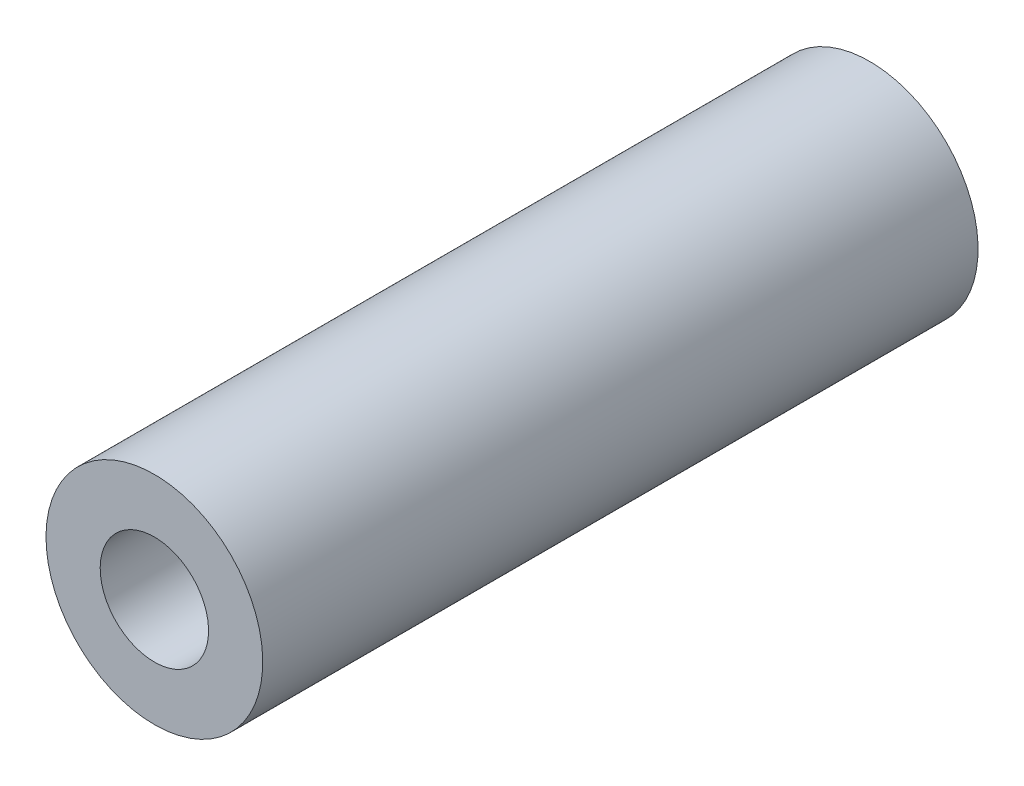
ISO-10303-21;
HEADER;
FILE_DESCRIPTION(('STEP AP214'),'2;1');
FILE_NAME('part.step','',(''),(''),'','','');
FILE_SCHEMA(('AUTOMOTIVE_DESIGN { 1 0 10303 214 1 1 1 1 }'));
ENDSEC;
DATA;
#1=APPLICATION_CONTEXT('core data for automotive mechanical design processes');
#2=APPLICATION_PROTOCOL_DEFINITION('international standard','automotive_design',2000,#1);
#3=PRODUCT_CONTEXT('',#1,'mechanical');
#4=PRODUCT('Part','Part','',(#3));
#5=PRODUCT_RELATED_PRODUCT_CATEGORY('part','',(#4));
#6=PRODUCT_DEFINITION_FORMATION('','',#4);
#7=PRODUCT_DEFINITION_CONTEXT('part definition',#1,'design');
#8=PRODUCT_DEFINITION('design','',#6,#7);
#9=PRODUCT_DEFINITION_SHAPE('','',#8);
#10=(LENGTH_UNIT() NAMED_UNIT(*) SI_UNIT(.MILLI.,.METRE.));
#11=(NAMED_UNIT(*) PLANE_ANGLE_UNIT() SI_UNIT($,.RADIAN.));
#12=(NAMED_UNIT(*) SI_UNIT($,.STERADIAN.) SOLID_ANGLE_UNIT());
#13=UNCERTAINTY_MEASURE_WITH_UNIT(LENGTH_MEASURE(1.E-05),#10,'distance_accuracy_value','');
#14=(GEOMETRIC_REPRESENTATION_CONTEXT(3) GLOBAL_UNCERTAINTY_ASSIGNED_CONTEXT((#13)) GLOBAL_UNIT_ASSIGNED_CONTEXT((#10,
#11,#12)) REPRESENTATION_CONTEXT('',''));
#15=CARTESIAN_POINT('',(0.,0.,0.));
#16=DIRECTION('',(0.,0.,1.));
#17=DIRECTION('',(1.,0.,0.));
#18=AXIS2_PLACEMENT_3D('',#15,#16,#17);
#19=CARTESIAN_POINT('',(0.,0.,52.749300195452));
#20=DIRECTION('',(0.,0.,1.));
#21=DIRECTION('',(-0.687239917551719,0.726430516789807,0.));
#22=AXIS2_PLACEMENT_3D('',#19,#20,#21);
#23=CYLINDRICAL_SURFACE('',#22,1.25);
#24=CARTESIAN_POINT('',(0.,0.,52.749300195452));
#25=DIRECTION('',(0.,0.,-1.));
#26=DIRECTION('',(0.687239917551719,-0.726430516789807,0.));
#27=AXIS2_PLACEMENT_3D('',#24,#25,#26);
#28=CIRCLE('',#27,1.25);
#29=CARTESIAN_POINT('',(0.859049896939649,-0.908038145987259,52.749300195452));
#30=VERTEX_POINT('',#29);
#31=EDGE_CURVE('E40',#30,#30,#28,.T.);
#32=ORIENTED_EDGE('',*,*,#31,.T.);
#33=EDGE_LOOP('',(#32));
#34=FACE_BOUND('',#33,.T.);
#35=CARTESIAN_POINT('',(0.,0.,69.249300195452));
#36=DIRECTION('',(0.,0.,-1.));
#37=DIRECTION('',(0.687239917551719,-0.726430516789807,0.));
#38=AXIS2_PLACEMENT_3D('',#35,#36,#37);
#39=CIRCLE('',#38,1.25);
#40=CARTESIAN_POINT('',(0.859049896939649,-0.908038145987259,69.249300195452));
#41=VERTEX_POINT('',#40);
#42=EDGE_CURVE('E11',#41,#41,#39,.T.);
#43=ORIENTED_EDGE('',*,*,#42,.F.);
#44=EDGE_LOOP('',(#43));
#45=FACE_BOUND('',#44,.T.);
#46=ADVANCED_FACE('F36',(#34,#45),#23,.F.);
#47=CARTESIAN_POINT('',(0.,0.,52.749300195452));
#48=DIRECTION('',(0.,0.,1.));
#49=DIRECTION('',(-0.687239917551719,0.726430516789807,0.));
#50=AXIS2_PLACEMENT_3D('',#47,#48,#49);
#51=CYLINDRICAL_SURFACE('',#50,2.5);
#52=CARTESIAN_POINT('',(0.,0.,52.749300195452));
#53=DIRECTION('',(0.,0.,-1.));
#54=DIRECTION('',(0.687239917551719,-0.726430516789807,0.));
#55=AXIS2_PLACEMENT_3D('',#52,#53,#54);
#56=CIRCLE('',#55,2.5);
#57=CARTESIAN_POINT('',(1.7180997938793,-1.81607629197452,52.749300195452));
#58=VERTEX_POINT('',#57);
#59=EDGE_CURVE('E66',#58,#58,#56,.T.);
#60=ORIENTED_EDGE('',*,*,#59,.F.);
#61=EDGE_LOOP('',(#60));
#62=FACE_BOUND('',#61,.T.);
#63=CARTESIAN_POINT('',(0.,0.,69.249300195452));
#64=DIRECTION('',(0.,0.,-1.));
#65=DIRECTION('',(0.687239917551719,-0.726430516789807,0.));
#66=AXIS2_PLACEMENT_3D('',#63,#64,#65);
#67=CIRCLE('',#66,2.5);
#68=CARTESIAN_POINT('',(1.7180997938793,-1.81607629197452,69.249300195452));
#69=VERTEX_POINT('',#68);
#70=EDGE_CURVE('E47',#69,#69,#67,.T.);
#71=ORIENTED_EDGE('',*,*,#70,.T.);
#72=EDGE_LOOP('',(#71));
#73=FACE_BOUND('',#72,.T.);
#74=ADVANCED_FACE('F38',(#62,#73),#51,.T.);
#75=CARTESIAN_POINT('',(0.,0.,69.249300195452));
#76=DIRECTION('',(0.,0.,-1.));
#77=DIRECTION('',(-0.687239917551719,0.726430516789807,0.));
#78=AXIS2_PLACEMENT_3D('',#75,#76,#77);
#79=PLANE('',#78);
#80=ORIENTED_EDGE('',*,*,#42,.T.);
#81=EDGE_LOOP('',(#80));
#82=FACE_BOUND('',#81,.T.);
#83=ORIENTED_EDGE('',*,*,#70,.F.);
#84=EDGE_LOOP('',(#83));
#85=FACE_BOUND('',#84,.T.);
#86=ADVANCED_FACE('F85',(#82,#85),#79,.F.);
#87=CARTESIAN_POINT('',(0.,0.,52.749300195452));
#88=DIRECTION('',(0.,0.,-1.));
#89=DIRECTION('',(-0.687239917551719,0.726430516789807,0.));
#90=AXIS2_PLACEMENT_3D('',#87,#88,#89);
#91=PLANE('',#90);
#92=ORIENTED_EDGE('',*,*,#31,.F.);
#93=EDGE_LOOP('',(#92));
#94=FACE_BOUND('',#93,.T.);
#95=ORIENTED_EDGE('',*,*,#59,.T.);
#96=EDGE_LOOP('',(#95));
#97=FACE_BOUND('',#96,.T.);
#98=ADVANCED_FACE('F87',(#94,#97),#91,.T.);
#99=CLOSED_SHELL('',(#46,#74,#86,#98));
#100=MANIFOLD_SOLID_BREP('B2',#99);
#101=ADVANCED_BREP_SHAPE_REPRESENTATION('',(#18,#100),#14);
#102=SHAPE_DEFINITION_REPRESENTATION(#9,#101);
ENDSEC;
END-ISO-10303-21;
